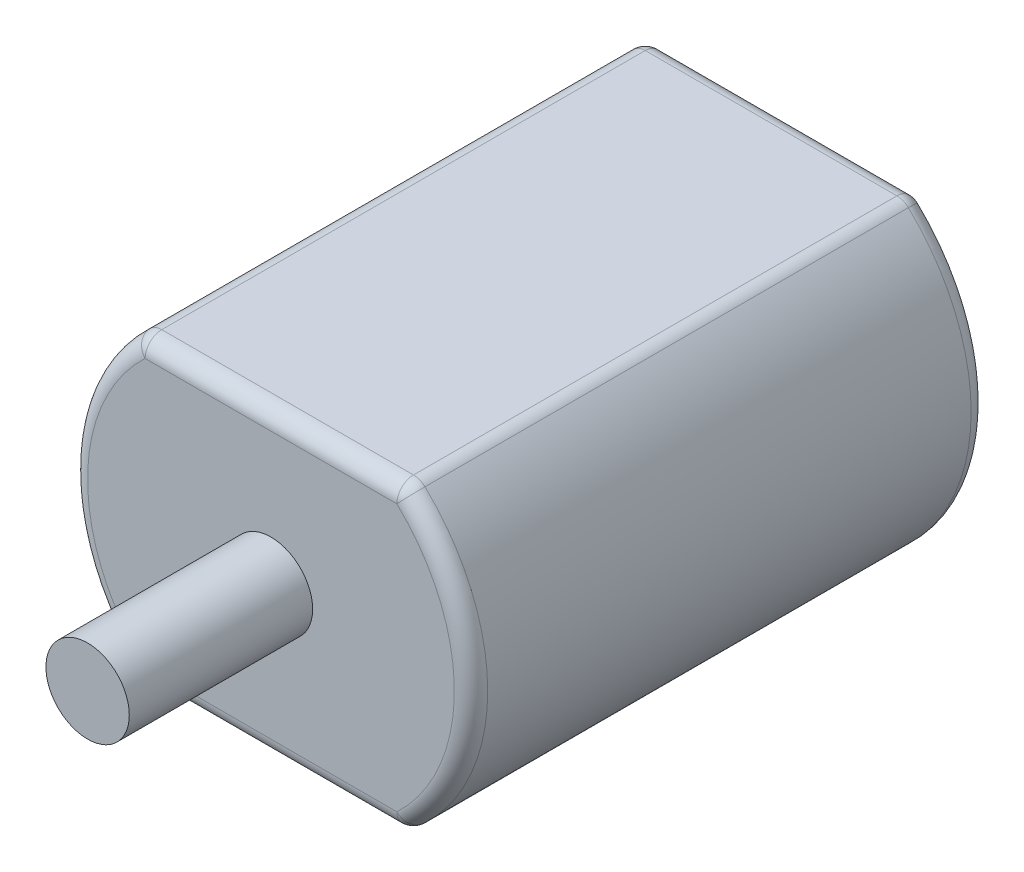
ISO-10303-21;
HEADER;
FILE_DESCRIPTION(('STEP AP214'),'2;1');
FILE_NAME('part.step','',(''),(''),'','','');
FILE_SCHEMA(('AUTOMOTIVE_DESIGN { 1 0 10303 214 1 1 1 1 }'));
ENDSEC;
DATA;
#1=APPLICATION_CONTEXT('core data for automotive mechanical design processes');
#2=APPLICATION_PROTOCOL_DEFINITION('international standard','automotive_design',2000,#1);
#3=PRODUCT_CONTEXT('',#1,'mechanical');
#4=PRODUCT('Part','Part','',(#3));
#5=PRODUCT_RELATED_PRODUCT_CATEGORY('part','',(#4));
#6=PRODUCT_DEFINITION_FORMATION('','',#4);
#7=PRODUCT_DEFINITION_CONTEXT('part definition',#1,'design');
#8=PRODUCT_DEFINITION('design','',#6,#7);
#9=PRODUCT_DEFINITION_SHAPE('','',#8);
#10=(LENGTH_UNIT() NAMED_UNIT(*) SI_UNIT(.MILLI.,.METRE.));
#11=(NAMED_UNIT(*) PLANE_ANGLE_UNIT() SI_UNIT($,.RADIAN.));
#12=(NAMED_UNIT(*) SI_UNIT($,.STERADIAN.) SOLID_ANGLE_UNIT());
#13=UNCERTAINTY_MEASURE_WITH_UNIT(LENGTH_MEASURE(1.E-05),#10,'distance_accuracy_value','');
#14=(GEOMETRIC_REPRESENTATION_CONTEXT(3) GLOBAL_UNCERTAINTY_ASSIGNED_CONTEXT((#13)) GLOBAL_UNIT_ASSIGNED_CONTEXT((#10,
#11,#12)) REPRESENTATION_CONTEXT('',''));
#15=CARTESIAN_POINT('',(0.,0.,0.));
#16=DIRECTION('',(0.,0.,1.));
#17=DIRECTION('',(1.,0.,0.));
#18=AXIS2_PLACEMENT_3D('',#15,#16,#17);
#19=CARTESIAN_POINT('',(-7.93725393319377,9.,31.));
#20=DIRECTION('',(0.,1.,0.));
#21=DIRECTION('',(0.,0.,1.));
#22=AXIS2_PLACEMENT_3D('',#19,#20,#21);
#23=PLANE('',#22);
#24=DIRECTION('',(1.,0.,0.));
#25=VECTOR('',#24,1.);
#26=CARTESIAN_POINT('',(-7.93725393319377,9.,1.));
#27=LINE('',#26,#25);
#28=CARTESIAN_POINT('',(7.54983443527075,9.,1.));
#29=VERTEX_POINT('',#28);
#30=CARTESIAN_POINT('',(-7.54983443527075,9.,1.));
#31=VERTEX_POINT('',#30);
#32=EDGE_CURVE('E225',#29,#31,#27,.F.);
#33=ORIENTED_EDGE('',*,*,#32,.T.);
#34=DIRECTION('',(0.,0.,1.));
#35=VECTOR('',#34,1.);
#36=CARTESIAN_POINT('',(-7.54983443527075,9.,31.));
#37=LINE('',#36,#35);
#38=CARTESIAN_POINT('',(-7.54983443527075,9.,30.));
#39=VERTEX_POINT('',#38);
#40=EDGE_CURVE('E228',#31,#39,#37,.T.);
#41=ORIENTED_EDGE('',*,*,#40,.T.);
#42=DIRECTION('',(1.,0.,0.));
#43=VECTOR('',#42,1.);
#44=CARTESIAN_POINT('',(-7.93725393319377,9.,30.));
#45=LINE('',#44,#43);
#46=CARTESIAN_POINT('',(7.54983443527075,9.,30.));
#47=VERTEX_POINT('',#46);
#48=EDGE_CURVE('E223',#39,#47,#45,.T.);
#49=ORIENTED_EDGE('',*,*,#48,.T.);
#50=DIRECTION('',(0.,0.,1.));
#51=VECTOR('',#50,1.);
#52=CARTESIAN_POINT('',(7.54983443527075,9.,0.));
#53=LINE('',#52,#51);
#54=EDGE_CURVE('E221',#47,#29,#53,.F.);
#55=ORIENTED_EDGE('',*,*,#54,.T.);
#56=EDGE_LOOP('',(#33,#41,#49,#55));
#57=FACE_BOUND('',#56,.T.);
#58=ADVANCED_FACE('F36',(#57),#23,.T.);
#59=CARTESIAN_POINT('',(0.,0.,31.));
#60=DIRECTION('',(0.,0.,-1.));
#61=DIRECTION('',(-1.,0.,0.));
#62=AXIS2_PLACEMENT_3D('',#59,#60,#61);
#63=CYLINDRICAL_SURFACE('',#62,12.);
#64=CARTESIAN_POINT('',(0.,0.,1.));
#65=DIRECTION('',(0.,0.,1.));
#66=DIRECTION('',(1.,0.,0.));
#67=AXIS2_PLACEMENT_3D('',#64,#65,#66);
#68=CIRCLE('',#67,12.);
#69=CARTESIAN_POINT('',(-8.23618302029536,8.72727272727273,1.));
#70=VERTEX_POINT('',#69);
#71=CARTESIAN_POINT('',(-8.23618302029536,-8.72727272727273,1.));
#72=VERTEX_POINT('',#71);
#73=EDGE_CURVE('E243',#70,#72,#68,.T.);
#74=ORIENTED_EDGE('',*,*,#73,.T.);
#75=DIRECTION('',(0.,0.,-1.));
#76=VECTOR('',#75,1.);
#77=CARTESIAN_POINT('',(-8.23618302029536,-8.72727272727273,31.));
#78=LINE('',#77,#76);
#79=CARTESIAN_POINT('',(-8.23618302029536,-8.72727272727273,30.));
#80=VERTEX_POINT('',#79);
#81=EDGE_CURVE('E245',#72,#80,#78,.F.);
#82=ORIENTED_EDGE('',*,*,#81,.T.);
#83=CARTESIAN_POINT('',(0.,0.,30.));
#84=DIRECTION('',(0.,0.,1.));
#85=DIRECTION('',(1.,0.,0.));
#86=AXIS2_PLACEMENT_3D('',#83,#84,#85);
#87=CIRCLE('',#86,12.);
#88=CARTESIAN_POINT('',(-8.23618302029536,8.72727272727273,30.));
#89=VERTEX_POINT('',#88);
#90=EDGE_CURVE('E241',#80,#89,#87,.F.);
#91=ORIENTED_EDGE('',*,*,#90,.T.);
#92=DIRECTION('',(0.,0.,-1.));
#93=VECTOR('',#92,1.);
#94=CARTESIAN_POINT('',(-8.23618302029536,8.72727272727273,31.));
#95=LINE('',#94,#93);
#96=EDGE_CURVE('E239',#89,#70,#95,.T.);
#97=ORIENTED_EDGE('',*,*,#96,.T.);
#98=EDGE_LOOP('',(#74,#82,#91,#97));
#99=FACE_BOUND('',#98,.T.);
#100=ADVANCED_FACE('F319',(#99),#63,.T.);
#101=CARTESIAN_POINT('',(-7.93725393319377,-9.,31.));
#102=DIRECTION('',(0.,1.,0.));
#103=DIRECTION('',(0.,0.,1.));
#104=AXIS2_PLACEMENT_3D('',#101,#102,#103);
#105=PLANE('',#104);
#106=DIRECTION('',(1.,0.,0.));
#107=VECTOR('',#106,1.);
#108=CARTESIAN_POINT('',(-7.93725393319377,-9.,30.));
#109=LINE('',#108,#107);
#110=CARTESIAN_POINT('',(7.54983443527075,-9.,30.));
#111=VERTEX_POINT('',#110);
#112=CARTESIAN_POINT('',(-7.54983443527075,-9.,30.));
#113=VERTEX_POINT('',#112);
#114=EDGE_CURVE('E230',#111,#113,#109,.F.);
#115=ORIENTED_EDGE('',*,*,#114,.T.);
#116=DIRECTION('',(0.,0.,-1.));
#117=VECTOR('',#116,1.);
#118=CARTESIAN_POINT('',(-7.54983443527075,-9.,31.));
#119=LINE('',#118,#117);
#120=CARTESIAN_POINT('',(-7.54983443527075,-9.,1.));
#121=VERTEX_POINT('',#120);
#122=EDGE_CURVE('E236',#113,#121,#119,.T.);
#123=ORIENTED_EDGE('',*,*,#122,.T.);
#124=DIRECTION('',(1.,0.,0.));
#125=VECTOR('',#124,1.);
#126=CARTESIAN_POINT('',(-7.93725393319377,-9.,1.));
#127=LINE('',#126,#125);
#128=CARTESIAN_POINT('',(7.54983443527075,-9.,1.));
#129=VERTEX_POINT('',#128);
#130=EDGE_CURVE('E234',#121,#129,#127,.T.);
#131=ORIENTED_EDGE('',*,*,#130,.T.);
#132=DIRECTION('',(0.,0.,-1.));
#133=VECTOR('',#132,1.);
#134=CARTESIAN_POINT('',(7.54983443527075,-9.,31.));
#135=LINE('',#134,#133);
#136=EDGE_CURVE('E232',#129,#111,#135,.F.);
#137=ORIENTED_EDGE('',*,*,#136,.T.);
#138=EDGE_LOOP('',(#115,#123,#131,#137));
#139=FACE_BOUND('',#138,.T.);
#140=ADVANCED_FACE('F304',(#139),#105,.F.);
#141=CARTESIAN_POINT('',(0.,0.,31.));
#142=DIRECTION('',(0.,0.,-1.));
#143=DIRECTION('',(-1.,0.,0.));
#144=AXIS2_PLACEMENT_3D('',#141,#142,#143);
#145=CYLINDRICAL_SURFACE('',#144,12.);
#146=DIRECTION('',(0.,0.,-1.));
#147=VECTOR('',#146,1.);
#148=CARTESIAN_POINT('',(8.23618302029536,-8.72727272727273,31.));
#149=LINE('',#148,#147);
#150=CARTESIAN_POINT('',(8.23618302029536,-8.72727272727273,30.));
#151=VERTEX_POINT('',#150);
#152=CARTESIAN_POINT('',(8.23618302029536,-8.72727272727273,1.));
#153=VERTEX_POINT('',#152);
#154=EDGE_CURVE('E252',#151,#153,#149,.T.);
#155=ORIENTED_EDGE('',*,*,#154,.T.);
#156=CARTESIAN_POINT('',(0.,0.,1.));
#157=DIRECTION('',(0.,0.,1.));
#158=DIRECTION('',(1.,0.,0.));
#159=AXIS2_PLACEMENT_3D('',#156,#157,#158);
#160=CIRCLE('',#159,12.);
#161=CARTESIAN_POINT('',(8.23618302029536,8.72727272727273,1.));
#162=VERTEX_POINT('',#161);
#163=EDGE_CURVE('E160',#153,#162,#160,.T.);
#164=ORIENTED_EDGE('',*,*,#163,.T.);
#165=DIRECTION('',(0.,0.,-1.));
#166=VECTOR('',#165,1.);
#167=CARTESIAN_POINT('',(8.23618302029536,8.72727272727273,31.));
#168=LINE('',#167,#166);
#169=CARTESIAN_POINT('',(8.23618302029536,8.72727272727273,30.));
#170=VERTEX_POINT('',#169);
#171=EDGE_CURVE('E248',#162,#170,#168,.F.);
#172=ORIENTED_EDGE('',*,*,#171,.T.);
#173=CARTESIAN_POINT('',(0.,0.,30.));
#174=DIRECTION('',(0.,0.,1.));
#175=DIRECTION('',(1.,0.,0.));
#176=AXIS2_PLACEMENT_3D('',#173,#174,#175);
#177=CIRCLE('',#176,12.);
#178=EDGE_CURVE('E250',#170,#151,#177,.F.);
#179=ORIENTED_EDGE('',*,*,#178,.T.);
#180=EDGE_LOOP('',(#155,#164,#172,#179));
#181=FACE_BOUND('',#180,.T.);
#182=ADVANCED_FACE('F297',(#181),#145,.T.);
#183=CARTESIAN_POINT('',(0.,0.,31.));
#184=DIRECTION('',(0.,0.,1.));
#185=DIRECTION('',(1.,0.,0.));
#186=AXIS2_PLACEMENT_3D('',#183,#184,#185);
#187=PLANE('',#186);
#188=CARTESIAN_POINT('',(0.,0.,31.));
#189=DIRECTION('',(0.,0.,1.));
#190=DIRECTION('',(1.,0.,0.));
#191=AXIS2_PLACEMENT_3D('',#188,#189,#190);
#192=CIRCLE('',#191,11.);
#193=CARTESIAN_POINT('',(-7.54983443527093,8.,31.));
#194=VERTEX_POINT('',#193);
#195=CARTESIAN_POINT('',(-7.54983443527093,-7.99999999999983,31.));
#196=VERTEX_POINT('',#195);
#197=EDGE_CURVE('E59',#194,#196,#192,.T.);
#198=ORIENTED_EDGE('',*,*,#197,.T.);
#199=DIRECTION('',(1.,0.,0.));
#200=VECTOR('',#199,1.);
#201=CARTESIAN_POINT('',(7.93725393319377,-8.,31.));
#202=LINE('',#201,#200);
#203=CARTESIAN_POINT('',(7.54983443527093,-7.99999999999983,31.));
#204=VERTEX_POINT('',#203);
#205=EDGE_CURVE('E11',#196,#204,#202,.T.);
#206=ORIENTED_EDGE('',*,*,#205,.T.);
#207=CARTESIAN_POINT('',(0.,0.,31.));
#208=DIRECTION('',(0.,0.,1.));
#209=DIRECTION('',(1.,0.,0.));
#210=AXIS2_PLACEMENT_3D('',#207,#208,#209);
#211=CIRCLE('',#210,11.);
#212=CARTESIAN_POINT('',(7.54983443527093,8.,31.));
#213=VERTEX_POINT('',#212);
#214=EDGE_CURVE('E45',#204,#213,#211,.T.);
#215=ORIENTED_EDGE('',*,*,#214,.T.);
#216=DIRECTION('',(1.,0.,0.));
#217=VECTOR('',#216,1.);
#218=CARTESIAN_POINT('',(0.,8.,31.));
#219=LINE('',#218,#217);
#220=EDGE_CURVE('E255',#213,#194,#219,.F.);
#221=ORIENTED_EDGE('',*,*,#220,.T.);
#222=EDGE_LOOP('',(#198,#206,#215,#221));
#223=FACE_BOUND('',#222,.T.);
#224=CARTESIAN_POINT('',(0.,0.,31.));
#225=DIRECTION('',(0.,0.,1.));
#226=DIRECTION('',(1.,0.,0.));
#227=AXIS2_PLACEMENT_3D('',#224,#225,#226);
#228=CIRCLE('',#227,2.5);
#229=CARTESIAN_POINT('',(2.5,0.,31.));
#230=VERTEX_POINT('',#229);
#231=EDGE_CURVE('E148',#230,#230,#228,.T.);
#232=ORIENTED_EDGE('',*,*,#231,.F.);
#233=EDGE_LOOP('',(#232));
#234=FACE_BOUND('',#233,.T.);
#235=ADVANCED_FACE('F521',(#223,#234),#187,.T.);
#236=CARTESIAN_POINT('',(0.,0.,0.));
#237=DIRECTION('',(0.,0.,1.));
#238=DIRECTION('',(1.,0.,0.));
#239=AXIS2_PLACEMENT_3D('',#236,#237,#238);
#240=PLANE('',#239);
#241=CARTESIAN_POINT('',(0.,0.,0.));
#242=DIRECTION('',(0.,0.,1.));
#243=DIRECTION('',(1.,0.,0.));
#244=AXIS2_PLACEMENT_3D('',#241,#242,#243);
#245=CIRCLE('',#244,11.);
#246=CARTESIAN_POINT('',(-7.54983443527093,-8.,0.));
#247=VERTEX_POINT('',#246);
#248=CARTESIAN_POINT('',(-7.54983443527093,7.99999999999983,0.));
#249=VERTEX_POINT('',#248);
#250=EDGE_CURVE('E137',#247,#249,#245,.F.);
#251=ORIENTED_EDGE('',*,*,#250,.T.);
#252=DIRECTION('',(1.,0.,0.));
#253=VECTOR('',#252,1.);
#254=CARTESIAN_POINT('',(7.93725393319378,8.,0.));
#255=LINE('',#254,#253);
#256=CARTESIAN_POINT('',(7.54983443527093,7.99999999999983,0.));
#257=VERTEX_POINT('',#256);
#258=EDGE_CURVE('E133',#249,#257,#255,.T.);
#259=ORIENTED_EDGE('',*,*,#258,.T.);
#260=CARTESIAN_POINT('',(0.,0.,0.));
#261=DIRECTION('',(0.,0.,1.));
#262=DIRECTION('',(1.,0.,0.));
#263=AXIS2_PLACEMENT_3D('',#260,#261,#262);
#264=CIRCLE('',#263,11.);
#265=CARTESIAN_POINT('',(7.54983443527093,-8.,0.));
#266=VERTEX_POINT('',#265);
#267=EDGE_CURVE('E127',#257,#266,#264,.F.);
#268=ORIENTED_EDGE('',*,*,#267,.T.);
#269=DIRECTION('',(1.,0.,0.));
#270=VECTOR('',#269,1.);
#271=CARTESIAN_POINT('',(0.,-8.,0.));
#272=LINE('',#271,#270);
#273=EDGE_CURVE('E130',#266,#247,#272,.F.);
#274=ORIENTED_EDGE('',*,*,#273,.T.);
#275=EDGE_LOOP('',(#251,#259,#268,#274));
#276=FACE_BOUND('',#275,.T.);
#277=ADVANCED_FACE('F129',(#276),#240,.F.);
#278=CARTESIAN_POINT('',(0.,0.,42.));
#279=DIRECTION('',(0.,0.,-1.));
#280=DIRECTION('',(-1.,0.,0.));
#281=AXIS2_PLACEMENT_3D('',#278,#279,#280);
#282=CYLINDRICAL_SURFACE('',#281,2.5);
#283=CARTESIAN_POINT('',(0.,0.,42.));
#284=DIRECTION('',(0.,0.,1.));
#285=DIRECTION('',(1.,0.,0.));
#286=AXIS2_PLACEMENT_3D('',#283,#284,#285);
#287=CIRCLE('',#286,2.5);
#288=CARTESIAN_POINT('',(2.5,0.,42.));
#289=VERTEX_POINT('',#288);
#290=EDGE_CURVE('E207',#289,#289,#287,.T.);
#291=ORIENTED_EDGE('',*,*,#290,.F.);
#292=EDGE_LOOP('',(#291));
#293=FACE_BOUND('',#292,.T.);
#294=ORIENTED_EDGE('',*,*,#231,.T.);
#295=EDGE_LOOP('',(#294));
#296=FACE_BOUND('',#295,.T.);
#297=ADVANCED_FACE('F506',(#293,#296),#282,.T.);
#298=CARTESIAN_POINT('',(0.,0.,42.));
#299=DIRECTION('',(0.,0.,1.));
#300=DIRECTION('',(1.,0.,0.));
#301=AXIS2_PLACEMENT_3D('',#298,#299,#300);
#302=PLANE('',#301);
#303=ORIENTED_EDGE('',*,*,#290,.T.);
#304=EDGE_LOOP('',(#303));
#305=FACE_BOUND('',#304,.T.);
#306=ADVANCED_FACE('F498',(#305),#302,.T.);
#307=CARTESIAN_POINT('',(0.,-8.,30.));
#308=DIRECTION('',(-1.,0.,0.));
#309=DIRECTION('',(0.,0.,1.));
#310=AXIS2_PLACEMENT_3D('',#307,#308,#309);
#311=CYLINDRICAL_SURFACE('',#310,1.);
#312=CARTESIAN_POINT('',(-7.54983443527075,-8.,30.));
#313=DIRECTION('',(-1.,0.,-3.43475248243408E-13));
#314=DIRECTION('',(-3.43475248243408E-13,0.,1.));
#315=AXIS2_PLACEMENT_3D('',#312,#313,#314);
#316=CIRCLE('',#315,1.);
#317=EDGE_CURVE('E40',#113,#196,#316,.T.);
#318=ORIENTED_EDGE('',*,*,#317,.F.);
#319=ORIENTED_EDGE('',*,*,#114,.F.);
#320=CARTESIAN_POINT('',(7.54983443527109,-8.,30.));
#321=DIRECTION('',(1.,-3.4260788650542E-13,0.));
#322=DIRECTION('',(3.4260788650542E-13,1.,0.));
#323=AXIS2_PLACEMENT_3D('',#320,#321,#322);
#324=CIRCLE('',#323,1.);
#325=EDGE_CURVE('E201',#204,#111,#324,.T.);
#326=ORIENTED_EDGE('',*,*,#325,.F.);
#327=ORIENTED_EDGE('',*,*,#205,.F.);
#328=EDGE_LOOP('',(#318,#319,#326,#327));
#329=FACE_BOUND('',#328,.T.);
#330=ADVANCED_FACE('F38',(#329),#311,.T.);
#331=CARTESIAN_POINT('',(-7.54983443527075,-8.,30.));
#332=DIRECTION('',(0.,0.,1.));
#333=DIRECTION('',(1.,0.,0.));
#334=AXIS2_PLACEMENT_3D('',#331,#332,#333);
#335=SPHERICAL_SURFACE('',#334,1.);
#336=CARTESIAN_POINT('',(-7.54983443527075,-8.,30.));
#337=DIRECTION('',(0.,0.,1.));
#338=DIRECTION('',(1.,0.,0.));
#339=AXIS2_PLACEMENT_3D('',#336,#337,#338);
#340=CIRCLE('',#339,1.);
#341=EDGE_CURVE('E196',#113,#80,#340,.F.);
#342=ORIENTED_EDGE('',*,*,#341,.F.);
#343=ORIENTED_EDGE('',*,*,#317,.T.);
#344=CARTESIAN_POINT('',(-7.54983443527093,-7.99999999999983,30.));
#345=DIRECTION('',(0.727272727272899,-0.686348585024432,0.));
#346=DIRECTION('',(0.686348585024432,0.727272727272899,0.));
#347=AXIS2_PLACEMENT_3D('',#344,#345,#346);
#348=CIRCLE('',#347,1.);
#349=EDGE_CURVE('E199',#80,#196,#348,.F.);
#350=ORIENTED_EDGE('',*,*,#349,.F.);
#351=EDGE_LOOP('',(#342,#343,#350));
#352=FACE_BOUND('',#351,.T.);
#353=ADVANCED_FACE('F307',(#352),#335,.T.);
#354=CARTESIAN_POINT('',(7.54983443527075,-8.,30.));
#355=DIRECTION('',(0.,0.,1.));
#356=DIRECTION('',(1.,0.,0.));
#357=AXIS2_PLACEMENT_3D('',#354,#355,#356);
#358=SPHERICAL_SURFACE('',#357,1.);
#359=CARTESIAN_POINT('',(7.54983443527075,-8.,30.));
#360=DIRECTION('',(-0.727272727272727,-0.686348585024613,2.49639867415366E-13));
#361=DIRECTION('',(0.686348585024614,-0.727272727272727,0.));
#362=AXIS2_PLACEMENT_3D('',#359,#360,#361);
#363=CIRCLE('',#362,1.);
#364=EDGE_CURVE('E191',#204,#151,#363,.F.);
#365=ORIENTED_EDGE('',*,*,#364,.F.);
#366=ORIENTED_EDGE('',*,*,#325,.T.);
#367=CARTESIAN_POINT('',(7.54983443527075,-8.,30.));
#368=DIRECTION('',(0.,0.,1.));
#369=DIRECTION('',(1.,0.,0.));
#370=AXIS2_PLACEMENT_3D('',#367,#368,#369);
#371=CIRCLE('',#370,1.);
#372=EDGE_CURVE('E193',#151,#111,#371,.F.);
#373=ORIENTED_EDGE('',*,*,#372,.F.);
#374=EDGE_LOOP('',(#365,#366,#373));
#375=FACE_BOUND('',#374,.T.);
#376=ADVANCED_FACE('F333',(#375),#358,.T.);
#377=CARTESIAN_POINT('',(0.,0.,30.));
#378=DIRECTION('',(0.,0.,1.));
#379=DIRECTION('',(1.,0.,0.));
#380=AXIS2_PLACEMENT_3D('',#377,#378,#379);
#381=TOROIDAL_SURFACE('',#380,11.,1.);
#382=ORIENTED_EDGE('',*,*,#349,.T.);
#383=ORIENTED_EDGE('',*,*,#197,.F.);
#384=CARTESIAN_POINT('',(-7.54983443527075,8.,30.));
#385=DIRECTION('',(0.727272727272727,0.686348585024613,2.50341668022376E-13));
#386=DIRECTION('',(-0.686348585024614,0.727272727272727,0.));
#387=AXIS2_PLACEMENT_3D('',#384,#385,#386);
#388=CIRCLE('',#387,1.);
#389=EDGE_CURVE('E185',#89,#194,#388,.T.);
#390=ORIENTED_EDGE('',*,*,#389,.F.);
#391=ORIENTED_EDGE('',*,*,#90,.F.);
#392=EDGE_LOOP('',(#382,#383,#390,#391));
#393=FACE_BOUND('',#392,.T.);
#394=ADVANCED_FACE('F322',(#393),#381,.T.);
#395=CARTESIAN_POINT('',(-7.54983443527075,-8.,31.));
#396=DIRECTION('',(0.,0.,-1.));
#397=DIRECTION('',(-1.,0.,0.));
#398=AXIS2_PLACEMENT_3D('',#395,#396,#397);
#399=CYLINDRICAL_SURFACE('',#398,1.);
#400=ORIENTED_EDGE('',*,*,#341,.T.);
#401=ORIENTED_EDGE('',*,*,#81,.F.);
#402=CARTESIAN_POINT('',(-7.54983443527075,-8.,1.));
#403=DIRECTION('',(0.,0.,-1.));
#404=DIRECTION('',(-1.,0.,0.));
#405=AXIS2_PLACEMENT_3D('',#402,#403,#404);
#406=CIRCLE('',#405,1.);
#407=EDGE_CURVE('E182',#121,#72,#406,.T.);
#408=ORIENTED_EDGE('',*,*,#407,.F.);
#409=ORIENTED_EDGE('',*,*,#122,.F.);
#410=EDGE_LOOP('',(#400,#401,#408,#409));
#411=FACE_BOUND('',#410,.T.);
#412=ADVANCED_FACE('F311',(#411),#399,.T.);
#413=CARTESIAN_POINT('',(-7.93725393319377,-8.,1.));
#414=DIRECTION('',(1.,0.,0.));
#415=DIRECTION('',(0.,0.,-1.));
#416=AXIS2_PLACEMENT_3D('',#413,#414,#415);
#417=CYLINDRICAL_SURFACE('',#416,1.);
#418=CARTESIAN_POINT('',(7.54983443527075,-8.,1.));
#419=DIRECTION('',(1.,0.,1.80411241501588E-13));
#420=DIRECTION('',(1.80411241501588E-13,0.,-1.));
#421=AXIS2_PLACEMENT_3D('',#418,#419,#420);
#422=CIRCLE('',#421,1.);
#423=EDGE_CURVE('E144',#129,#266,#422,.T.);
#424=ORIENTED_EDGE('',*,*,#423,.F.);
#425=ORIENTED_EDGE('',*,*,#130,.F.);
#426=CARTESIAN_POINT('',(-7.54983443527093,-8.,1.));
#427=DIRECTION('',(-1.,-1.81278603239576E-13,0.));
#428=DIRECTION('',(1.81278603239576E-13,-1.,0.));
#429=AXIS2_PLACEMENT_3D('',#426,#427,#428);
#430=CIRCLE('',#429,1.);
#431=EDGE_CURVE('E146',#247,#121,#430,.T.);
#432=ORIENTED_EDGE('',*,*,#431,.F.);
#433=ORIENTED_EDGE('',*,*,#273,.F.);
#434=EDGE_LOOP('',(#424,#425,#432,#433));
#435=FACE_BOUND('',#434,.T.);
#436=ADVANCED_FACE('F142',(#435),#417,.T.);
#437=CARTESIAN_POINT('',(7.54983443527075,-8.,31.));
#438=DIRECTION('',(0.,0.,-1.));
#439=DIRECTION('',(-1.,0.,0.));
#440=AXIS2_PLACEMENT_3D('',#437,#438,#439);
#441=CYLINDRICAL_SURFACE('',#440,1.);
#442=ORIENTED_EDGE('',*,*,#372,.T.);
#443=ORIENTED_EDGE('',*,*,#136,.F.);
#444=CARTESIAN_POINT('',(7.54983443527075,-8.,1.));
#445=DIRECTION('',(0.,0.,-1.));
#446=DIRECTION('',(-1.,0.,0.));
#447=AXIS2_PLACEMENT_3D('',#444,#445,#446);
#448=CIRCLE('',#447,1.);
#449=EDGE_CURVE('E156',#153,#129,#448,.T.);
#450=ORIENTED_EDGE('',*,*,#449,.F.);
#451=ORIENTED_EDGE('',*,*,#154,.F.);
#452=EDGE_LOOP('',(#442,#443,#450,#451));
#453=FACE_BOUND('',#452,.T.);
#454=ADVANCED_FACE('F301',(#453),#441,.T.);
#455=CARTESIAN_POINT('',(0.,0.,30.));
#456=DIRECTION('',(0.,0.,1.));
#457=DIRECTION('',(1.,0.,0.));
#458=AXIS2_PLACEMENT_3D('',#455,#456,#457);
#459=TOROIDAL_SURFACE('',#458,11.,1.);
#460=ORIENTED_EDGE('',*,*,#364,.T.);
#461=ORIENTED_EDGE('',*,*,#178,.F.);
#462=CARTESIAN_POINT('',(7.54983443527093,7.99999999999983,30.));
#463=DIRECTION('',(-0.727272727272899,0.686348585024432,0.));
#464=DIRECTION('',(-0.686348585024432,-0.727272727272899,0.));
#465=AXIS2_PLACEMENT_3D('',#462,#463,#464);
#466=CIRCLE('',#465,1.);
#467=EDGE_CURVE('E177',#213,#170,#466,.T.);
#468=ORIENTED_EDGE('',*,*,#467,.F.);
#469=ORIENTED_EDGE('',*,*,#214,.F.);
#470=EDGE_LOOP('',(#460,#461,#468,#469));
#471=FACE_BOUND('',#470,.T.);
#472=ADVANCED_FACE('F332',(#471),#459,.T.);
#473=CARTESIAN_POINT('',(-7.93725393319377,8.,30.));
#474=DIRECTION('',(1.,0.,0.));
#475=DIRECTION('',(0.,0.,-1.));
#476=AXIS2_PLACEMENT_3D('',#473,#474,#475);
#477=CYLINDRICAL_SURFACE('',#476,1.);
#478=CARTESIAN_POINT('',(-7.54983443527093,8.,30.));
#479=DIRECTION('',(-1.,1.81278603239576E-13,0.));
#480=DIRECTION('',(-1.81278603239576E-13,-1.,0.));
#481=AXIS2_PLACEMENT_3D('',#478,#479,#480);
#482=CIRCLE('',#481,1.);
#483=EDGE_CURVE('E188',#194,#39,#482,.T.);
#484=ORIENTED_EDGE('',*,*,#483,.F.);
#485=ORIENTED_EDGE('',*,*,#220,.F.);
#486=CARTESIAN_POINT('',(7.54983443527075,8.,30.));
#487=DIRECTION('',(1.,0.,-1.80411241501588E-13));
#488=DIRECTION('',(-1.80411241501588E-13,0.,-1.));
#489=AXIS2_PLACEMENT_3D('',#486,#487,#488);
#490=CIRCLE('',#489,1.);
#491=EDGE_CURVE('E174',#47,#213,#490,.T.);
#492=ORIENTED_EDGE('',*,*,#491,.F.);
#493=ORIENTED_EDGE('',*,*,#48,.F.);
#494=EDGE_LOOP('',(#484,#485,#492,#493));
#495=FACE_BOUND('',#494,.T.);
#496=ADVANCED_FACE('F328',(#495),#477,.T.);
#497=CARTESIAN_POINT('',(-7.54983443527075,8.,30.));
#498=DIRECTION('',(0.,0.,1.));
#499=DIRECTION('',(1.,0.,0.));
#500=AXIS2_PLACEMENT_3D('',#497,#498,#499);
#501=SPHERICAL_SURFACE('',#500,1.);
#502=ORIENTED_EDGE('',*,*,#389,.T.);
#503=ORIENTED_EDGE('',*,*,#483,.T.);
#504=CARTESIAN_POINT('',(-7.54983443527075,8.,30.));
#505=DIRECTION('',(0.,0.,1.));
#506=DIRECTION('',(1.,0.,0.));
#507=AXIS2_PLACEMENT_3D('',#504,#505,#506);
#508=CIRCLE('',#507,1.);
#509=EDGE_CURVE('E165',#89,#39,#508,.F.);
#510=ORIENTED_EDGE('',*,*,#509,.F.);
#511=EDGE_LOOP('',(#502,#503,#510));
#512=FACE_BOUND('',#511,.T.);
#513=ADVANCED_FACE('F325',(#512),#501,.T.);
#514=CARTESIAN_POINT('',(-7.54983443527075,-8.,1.));
#515=DIRECTION('',(0.,0.,1.));
#516=DIRECTION('',(1.,0.,0.));
#517=AXIS2_PLACEMENT_3D('',#514,#515,#516);
#518=SPHERICAL_SURFACE('',#517,1.);
#519=ORIENTED_EDGE('',*,*,#431,.T.);
#520=ORIENTED_EDGE('',*,*,#407,.T.);
#521=CARTESIAN_POINT('',(-7.54983443527075,-8.,1.));
#522=DIRECTION('',(0.727272727272727,-0.686348585024613,-2.50341668022376E-13));
#523=DIRECTION('',(0.686348585024614,0.727272727272727,0.));
#524=AXIS2_PLACEMENT_3D('',#521,#522,#523);
#525=CIRCLE('',#524,1.);
#526=EDGE_CURVE('E161',#247,#72,#525,.F.);
#527=ORIENTED_EDGE('',*,*,#526,.F.);
#528=EDGE_LOOP('',(#519,#520,#527));
#529=FACE_BOUND('',#528,.T.);
#530=ADVANCED_FACE('F313',(#529),#518,.T.);
#531=CARTESIAN_POINT('',(7.54983443527075,-8.,1.));
#532=DIRECTION('',(0.,0.,1.));
#533=DIRECTION('',(1.,0.,0.));
#534=AXIS2_PLACEMENT_3D('',#531,#532,#533);
#535=SPHERICAL_SURFACE('',#534,1.);
#536=ORIENTED_EDGE('',*,*,#449,.T.);
#537=ORIENTED_EDGE('',*,*,#423,.T.);
#538=CARTESIAN_POINT('',(7.54983443527093,-7.99999999999983,1.));
#539=DIRECTION('',(-0.727272727272899,-0.686348585024432,0.));
#540=DIRECTION('',(0.686348585024432,-0.727272727272899,0.));
#541=AXIS2_PLACEMENT_3D('',#538,#539,#540);
#542=CIRCLE('',#541,1.);
#543=EDGE_CURVE('E153',#153,#266,#542,.F.);
#544=ORIENTED_EDGE('',*,*,#543,.F.);
#545=EDGE_LOOP('',(#536,#537,#544));
#546=FACE_BOUND('',#545,.T.);
#547=ADVANCED_FACE('F152',(#546),#535,.T.);
#548=CARTESIAN_POINT('',(7.54983443527075,8.,30.));
#549=DIRECTION('',(0.,0.,1.));
#550=DIRECTION('',(1.,0.,0.));
#551=AXIS2_PLACEMENT_3D('',#548,#549,#550);
#552=SPHERICAL_SURFACE('',#551,1.);
#553=ORIENTED_EDGE('',*,*,#491,.T.);
#554=ORIENTED_EDGE('',*,*,#467,.T.);
#555=CARTESIAN_POINT('',(7.54983443527075,8.,30.));
#556=DIRECTION('',(0.,0.,1.));
#557=DIRECTION('',(1.,0.,0.));
#558=AXIS2_PLACEMENT_3D('',#555,#556,#557);
#559=CIRCLE('',#558,1.);
#560=EDGE_CURVE('E162',#47,#170,#559,.F.);
#561=ORIENTED_EDGE('',*,*,#560,.F.);
#562=EDGE_LOOP('',(#553,#554,#561));
#563=FACE_BOUND('',#562,.T.);
#564=ADVANCED_FACE('F331',(#563),#552,.T.);
#565=CARTESIAN_POINT('',(-7.54983443527075,8.,31.));
#566=DIRECTION('',(0.,0.,-1.));
#567=DIRECTION('',(-1.,0.,0.));
#568=AXIS2_PLACEMENT_3D('',#565,#566,#567);
#569=CYLINDRICAL_SURFACE('',#568,1.);
#570=ORIENTED_EDGE('',*,*,#509,.T.);
#571=ORIENTED_EDGE('',*,*,#40,.F.);
#572=CARTESIAN_POINT('',(-7.54983443527075,8.,1.));
#573=DIRECTION('',(0.,0.,-1.));
#574=DIRECTION('',(-1.,0.,0.));
#575=AXIS2_PLACEMENT_3D('',#572,#573,#574);
#576=CIRCLE('',#575,1.);
#577=EDGE_CURVE('E168',#70,#31,#576,.T.);
#578=ORIENTED_EDGE('',*,*,#577,.F.);
#579=ORIENTED_EDGE('',*,*,#96,.F.);
#580=EDGE_LOOP('',(#570,#571,#578,#579));
#581=FACE_BOUND('',#580,.T.);
#582=ADVANCED_FACE('F279',(#581),#569,.T.);
#583=CARTESIAN_POINT('',(0.,0.,1.));
#584=DIRECTION('',(0.,0.,1.));
#585=DIRECTION('',(1.,0.,0.));
#586=AXIS2_PLACEMENT_3D('',#583,#584,#585);
#587=TOROIDAL_SURFACE('',#586,11.,1.);
#588=ORIENTED_EDGE('',*,*,#526,.T.);
#589=ORIENTED_EDGE('',*,*,#73,.F.);
#590=CARTESIAN_POINT('',(-7.54983443527093,7.99999999999983,1.));
#591=DIRECTION('',(0.727272727272899,0.686348585024432,0.));
#592=DIRECTION('',(-0.686348585024432,0.727272727272899,0.));
#593=AXIS2_PLACEMENT_3D('',#590,#591,#592);
#594=CIRCLE('',#593,1.);
#595=EDGE_CURVE('E268',#249,#70,#594,.T.);
#596=ORIENTED_EDGE('',*,*,#595,.F.);
#597=ORIENTED_EDGE('',*,*,#250,.F.);
#598=EDGE_LOOP('',(#588,#589,#596,#597));
#599=FACE_BOUND('',#598,.T.);
#600=ADVANCED_FACE('F317',(#599),#587,.T.);
#601=CARTESIAN_POINT('',(0.,0.,1.));
#602=DIRECTION('',(0.,0.,1.));
#603=DIRECTION('',(1.,0.,0.));
#604=AXIS2_PLACEMENT_3D('',#601,#602,#603);
#605=TOROIDAL_SURFACE('',#604,11.,1.);
#606=ORIENTED_EDGE('',*,*,#543,.T.);
#607=ORIENTED_EDGE('',*,*,#267,.F.);
#608=CARTESIAN_POINT('',(7.54983443527075,8.,1.));
#609=DIRECTION('',(-0.727272727272727,0.686348585024613,-2.49639867415366E-13));
#610=DIRECTION('',(-0.686348585024614,-0.727272727272727,0.));
#611=AXIS2_PLACEMENT_3D('',#608,#609,#610);
#612=CIRCLE('',#611,1.);
#613=EDGE_CURVE('E265',#162,#257,#612,.T.);
#614=ORIENTED_EDGE('',*,*,#613,.F.);
#615=ORIENTED_EDGE('',*,*,#163,.F.);
#616=EDGE_LOOP('',(#606,#607,#614,#615));
#617=FACE_BOUND('',#616,.T.);
#618=ADVANCED_FACE('F158',(#617),#605,.T.);
#619=CARTESIAN_POINT('',(7.54983443527075,8.,31.));
#620=DIRECTION('',(0.,0.,-1.));
#621=DIRECTION('',(-1.,0.,0.));
#622=AXIS2_PLACEMENT_3D('',#619,#620,#621);
#623=CYLINDRICAL_SURFACE('',#622,1.);
#624=ORIENTED_EDGE('',*,*,#560,.T.);
#625=ORIENTED_EDGE('',*,*,#171,.F.);
#626=CARTESIAN_POINT('',(7.54983443527075,8.,1.));
#627=DIRECTION('',(0.,0.,-1.));
#628=DIRECTION('',(-1.,0.,0.));
#629=AXIS2_PLACEMENT_3D('',#626,#627,#628);
#630=CIRCLE('',#629,1.);
#631=EDGE_CURVE('E263',#29,#162,#630,.T.);
#632=ORIENTED_EDGE('',*,*,#631,.F.);
#633=ORIENTED_EDGE('',*,*,#54,.F.);
#634=EDGE_LOOP('',(#624,#625,#632,#633));
#635=FACE_BOUND('',#634,.T.);
#636=ADVANCED_FACE('F293',(#635),#623,.T.);
#637=CARTESIAN_POINT('',(-7.54983443527075,8.,1.));
#638=DIRECTION('',(0.,0.,1.));
#639=DIRECTION('',(1.,0.,0.));
#640=AXIS2_PLACEMENT_3D('',#637,#638,#639);
#641=SPHERICAL_SURFACE('',#640,1.);
#642=ORIENTED_EDGE('',*,*,#595,.T.);
#643=ORIENTED_EDGE('',*,*,#577,.T.);
#644=CARTESIAN_POINT('',(-7.54983443527075,8.,1.));
#645=DIRECTION('',(-1.,0.,3.43475248243408E-13));
#646=DIRECTION('',(3.43475248243408E-13,0.,1.));
#647=AXIS2_PLACEMENT_3D('',#644,#645,#646);
#648=CIRCLE('',#647,1.);
#649=EDGE_CURVE('E261',#249,#31,#648,.F.);
#650=ORIENTED_EDGE('',*,*,#649,.F.);
#651=EDGE_LOOP('',(#642,#643,#650));
#652=FACE_BOUND('',#651,.T.);
#653=ADVANCED_FACE('F275',(#652),#641,.T.);
#654=CARTESIAN_POINT('',(7.54983443527075,8.,1.));
#655=DIRECTION('',(0.,0.,1.));
#656=DIRECTION('',(1.,0.,0.));
#657=AXIS2_PLACEMENT_3D('',#654,#655,#656);
#658=SPHERICAL_SURFACE('',#657,1.);
#659=ORIENTED_EDGE('',*,*,#631,.T.);
#660=ORIENTED_EDGE('',*,*,#613,.T.);
#661=CARTESIAN_POINT('',(7.54983443527109,8.,1.));
#662=DIRECTION('',(1.,3.4260788650542E-13,0.));
#663=DIRECTION('',(-3.4260788650542E-13,1.,0.));
#664=AXIS2_PLACEMENT_3D('',#661,#662,#663);
#665=CIRCLE('',#664,1.);
#666=EDGE_CURVE('E259',#29,#257,#665,.F.);
#667=ORIENTED_EDGE('',*,*,#666,.F.);
#668=EDGE_LOOP('',(#659,#660,#667));
#669=FACE_BOUND('',#668,.T.);
#670=ADVANCED_FACE('F290',(#669),#658,.T.);
#671=CARTESIAN_POINT('',(0.,8.,1.));
#672=DIRECTION('',(-1.,0.,0.));
#673=DIRECTION('',(0.,0.,1.));
#674=AXIS2_PLACEMENT_3D('',#671,#672,#673);
#675=CYLINDRICAL_SURFACE('',#674,1.);
#676=ORIENTED_EDGE('',*,*,#649,.T.);
#677=ORIENTED_EDGE('',*,*,#32,.F.);
#678=ORIENTED_EDGE('',*,*,#666,.T.);
#679=ORIENTED_EDGE('',*,*,#258,.F.);
#680=EDGE_LOOP('',(#676,#677,#678,#679));
#681=FACE_BOUND('',#680,.T.);
#682=ADVANCED_FACE('F288',(#681),#675,.T.);
#683=CLOSED_SHELL('',(#58,#100,#140,#182,#235,#277,#297,#306,#330,#353,#376,#394,#412,#436,#454,
#472,#496,#513,#530,#547,#564,#582,#600,#618,#636,#653,#670,#682));
#684=MANIFOLD_SOLID_BREP('B2',#683);
#685=ADVANCED_BREP_SHAPE_REPRESENTATION('',(#18,#684),#14);
#686=SHAPE_DEFINITION_REPRESENTATION(#9,#685);
ENDSEC;
END-ISO-10303-21;
